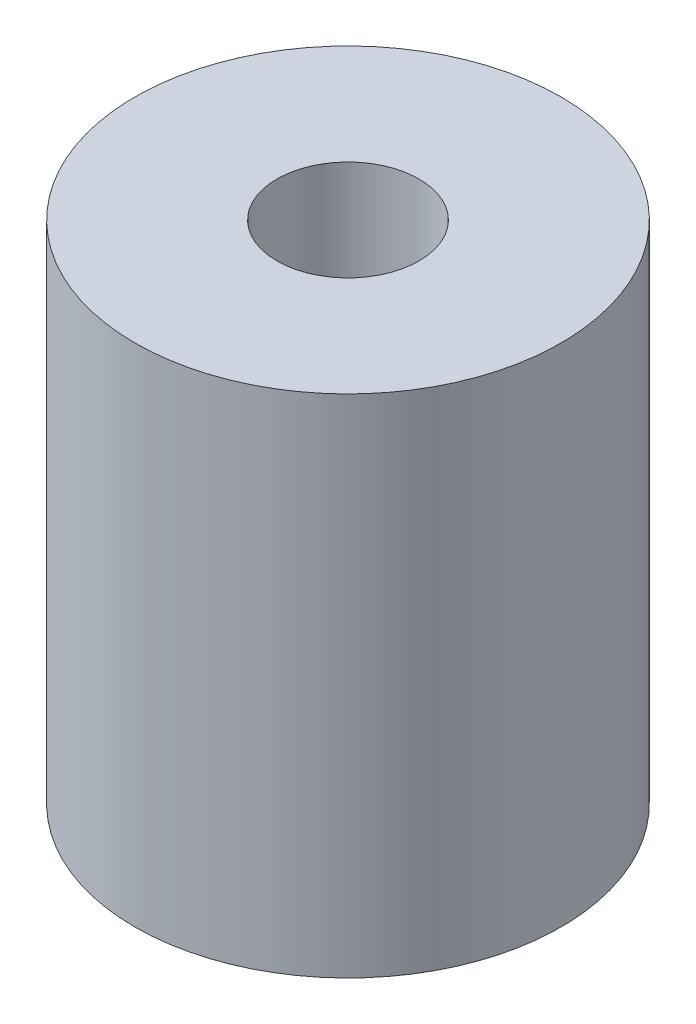
ISO-10303-21;
HEADER;
FILE_DESCRIPTION(('STEP AP214'),'2;1');
FILE_NAME('part.step','',(''),(''),'','','');
FILE_SCHEMA(('AUTOMOTIVE_DESIGN { 1 0 10303 214 1 1 1 1 }'));
ENDSEC;
DATA;
#1=APPLICATION_CONTEXT('core data for automotive mechanical design processes');
#2=APPLICATION_PROTOCOL_DEFINITION('international standard','automotive_design',2000,#1);
#3=PRODUCT_CONTEXT('',#1,'mechanical');
#4=PRODUCT('Part','Part','',(#3));
#5=PRODUCT_RELATED_PRODUCT_CATEGORY('part','',(#4));
#6=PRODUCT_DEFINITION_FORMATION('','',#4);
#7=PRODUCT_DEFINITION_CONTEXT('part definition',#1,'design');
#8=PRODUCT_DEFINITION('design','',#6,#7);
#9=PRODUCT_DEFINITION_SHAPE('','',#8);
#10=(LENGTH_UNIT() NAMED_UNIT(*) SI_UNIT(.MILLI.,.METRE.));
#11=(NAMED_UNIT(*) PLANE_ANGLE_UNIT() SI_UNIT($,.RADIAN.));
#12=(NAMED_UNIT(*) SI_UNIT($,.STERADIAN.) SOLID_ANGLE_UNIT());
#13=UNCERTAINTY_MEASURE_WITH_UNIT(LENGTH_MEASURE(1.E-05),#10,'distance_accuracy_value','');
#14=(GEOMETRIC_REPRESENTATION_CONTEXT(3) GLOBAL_UNCERTAINTY_ASSIGNED_CONTEXT((#13)) GLOBAL_UNIT_ASSIGNED_CONTEXT((#10,
#11,#12)) REPRESENTATION_CONTEXT('',''));
#15=CARTESIAN_POINT('',(0.,0.,0.));
#16=DIRECTION('',(0.,0.,1.));
#17=DIRECTION('',(1.,0.,0.));
#18=AXIS2_PLACEMENT_3D('',#15,#16,#17);
#19=CARTESIAN_POINT('',(0.,22.61,0.));
#20=DIRECTION('',(0.,-1.,0.));
#21=DIRECTION('',(0.,0.,-1.));
#22=AXIS2_PLACEMENT_3D('',#19,#20,#21);
#23=CYLINDRICAL_SURFACE('',#22,3.175);
#24=CARTESIAN_POINT('',(0.,22.61,0.));
#25=DIRECTION('',(0.,1.,0.));
#26=DIRECTION('',(0.,0.,1.));
#27=AXIS2_PLACEMENT_3D('',#24,#25,#26);
#28=CIRCLE('',#27,3.175);
#29=CARTESIAN_POINT('',(0.,22.61,3.175));
#30=VERTEX_POINT('',#29);
#31=EDGE_CURVE('E48',#30,#30,#28,.T.);
#32=ORIENTED_EDGE('',*,*,#31,.T.);
#33=EDGE_LOOP('',(#32));
#34=FACE_BOUND('',#33,.T.);
#35=CARTESIAN_POINT('',(0.,0.,0.));
#36=DIRECTION('',(0.,1.,0.));
#37=DIRECTION('',(0.,0.,1.));
#38=AXIS2_PLACEMENT_3D('',#35,#36,#37);
#39=CIRCLE('',#38,3.175);
#40=CARTESIAN_POINT('',(0.,0.,3.175));
#41=VERTEX_POINT('',#40);
#42=EDGE_CURVE('E53',#41,#41,#39,.T.);
#43=ORIENTED_EDGE('',*,*,#42,.F.);
#44=EDGE_LOOP('',(#43));
#45=FACE_BOUND('',#44,.T.);
#46=ADVANCED_FACE('F41',(#34,#45),#23,.F.);
#47=CARTESIAN_POINT('',(0.,22.61,0.));
#48=DIRECTION('',(0.,-1.,0.));
#49=DIRECTION('',(0.,0.,-1.));
#50=AXIS2_PLACEMENT_3D('',#47,#48,#49);
#51=CYLINDRICAL_SURFACE('',#50,9.525);
#52=CARTESIAN_POINT('',(0.,22.61,0.));
#53=DIRECTION('',(0.,1.,0.));
#54=DIRECTION('',(0.,0.,1.));
#55=AXIS2_PLACEMENT_3D('',#52,#53,#54);
#56=CIRCLE('',#55,9.525);
#57=CARTESIAN_POINT('',(0.,22.61,9.525));
#58=VERTEX_POINT('',#57);
#59=EDGE_CURVE('E10',#58,#58,#56,.T.);
#60=ORIENTED_EDGE('',*,*,#59,.F.);
#61=EDGE_LOOP('',(#60));
#62=FACE_BOUND('',#61,.T.);
#63=CARTESIAN_POINT('',(0.,0.,0.));
#64=DIRECTION('',(0.,1.,0.));
#65=DIRECTION('',(0.,0.,1.));
#66=AXIS2_PLACEMENT_3D('',#63,#64,#65);
#67=CIRCLE('',#66,9.525);
#68=CARTESIAN_POINT('',(0.,0.,9.525));
#69=VERTEX_POINT('',#68);
#70=EDGE_CURVE('E42',#69,#69,#67,.T.);
#71=ORIENTED_EDGE('',*,*,#70,.T.);
#72=EDGE_LOOP('',(#71));
#73=FACE_BOUND('',#72,.T.);
#74=ADVANCED_FACE('F63',(#62,#73),#51,.T.);
#75=CARTESIAN_POINT('',(0.,22.61,0.));
#76=DIRECTION('',(0.,1.,0.));
#77=DIRECTION('',(0.,0.,1.));
#78=AXIS2_PLACEMENT_3D('',#75,#76,#77);
#79=PLANE('',#78);
#80=ORIENTED_EDGE('',*,*,#31,.F.);
#81=EDGE_LOOP('',(#80));
#82=FACE_BOUND('',#81,.T.);
#83=ORIENTED_EDGE('',*,*,#59,.T.);
#84=EDGE_LOOP('',(#83));
#85=FACE_BOUND('',#84,.T.);
#86=ADVANCED_FACE('F62',(#82,#85),#79,.T.);
#87=CARTESIAN_POINT('',(0.,0.,0.));
#88=DIRECTION('',(0.,1.,0.));
#89=DIRECTION('',(0.,0.,1.));
#90=AXIS2_PLACEMENT_3D('',#87,#88,#89);
#91=PLANE('',#90);
#92=ORIENTED_EDGE('',*,*,#42,.T.);
#93=EDGE_LOOP('',(#92));
#94=FACE_BOUND('',#93,.T.);
#95=ORIENTED_EDGE('',*,*,#70,.F.);
#96=EDGE_LOOP('',(#95));
#97=FACE_BOUND('',#96,.T.);
#98=ADVANCED_FACE('F61',(#94,#97),#91,.F.);
#99=CLOSED_SHELL('',(#46,#74,#86,#98));
#100=MANIFOLD_SOLID_BREP('B2',#99);
#101=ADVANCED_BREP_SHAPE_REPRESENTATION('',(#18,#100),#14);
#102=SHAPE_DEFINITION_REPRESENTATION(#9,#101);
ENDSEC;
END-ISO-10303-21;
